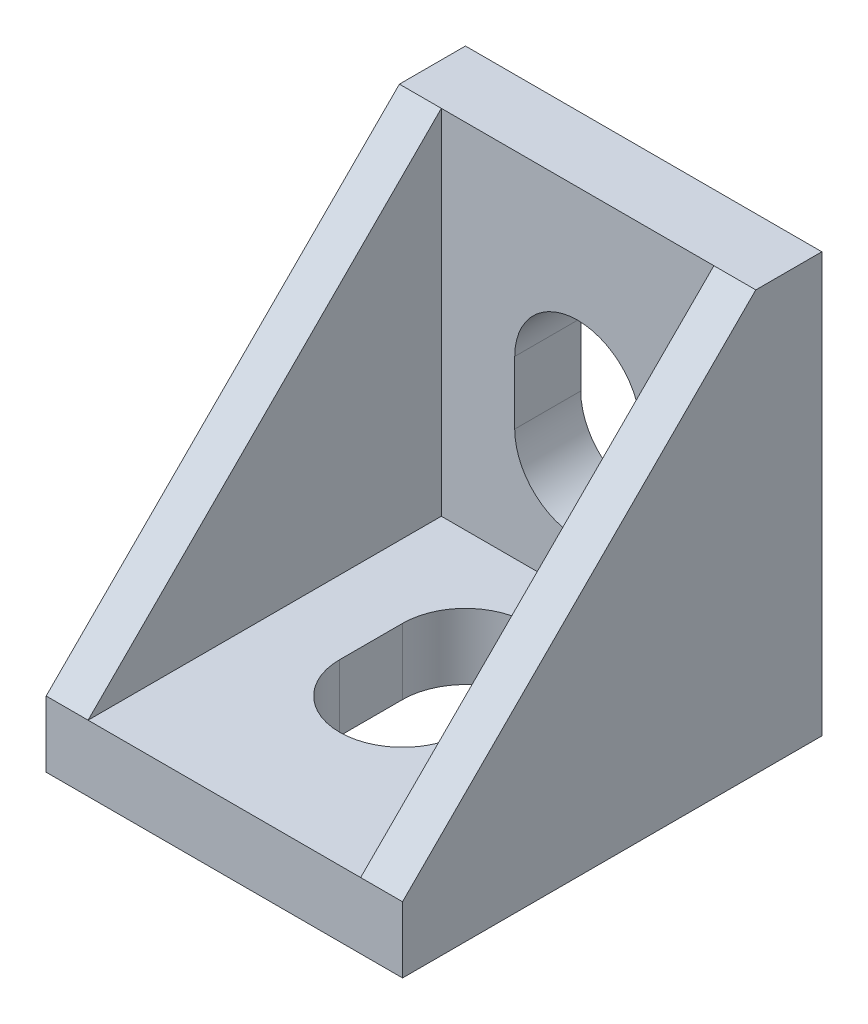
ISO-10303-21;
HEADER;
FILE_DESCRIPTION(('STEP AP214'),'2;1');
FILE_NAME('part.step','',(''),(''),'','','');
FILE_SCHEMA(('AUTOMOTIVE_DESIGN { 1 0 10303 214 1 1 1 1 }'));
ENDSEC;
DATA;
#1=APPLICATION_CONTEXT('core data for automotive mechanical design processes');
#2=APPLICATION_PROTOCOL_DEFINITION('international standard','automotive_design',2000,#1);
#3=PRODUCT_CONTEXT('',#1,'mechanical');
#4=PRODUCT('Part','Part','',(#3));
#5=PRODUCT_RELATED_PRODUCT_CATEGORY('part','',(#4));
#6=PRODUCT_DEFINITION_FORMATION('','',#4);
#7=PRODUCT_DEFINITION_CONTEXT('part definition',#1,'design');
#8=PRODUCT_DEFINITION('design','',#6,#7);
#9=PRODUCT_DEFINITION_SHAPE('','',#8);
#10=(LENGTH_UNIT() NAMED_UNIT(*) SI_UNIT(.MILLI.,.METRE.));
#11=(NAMED_UNIT(*) PLANE_ANGLE_UNIT() SI_UNIT($,.RADIAN.));
#12=(NAMED_UNIT(*) SI_UNIT($,.STERADIAN.) SOLID_ANGLE_UNIT());
#13=UNCERTAINTY_MEASURE_WITH_UNIT(LENGTH_MEASURE(1.E-05),#10,'distance_accuracy_value','');
#14=(GEOMETRIC_REPRESENTATION_CONTEXT(3) GLOBAL_UNCERTAINTY_ASSIGNED_CONTEXT((#13)) GLOBAL_UNIT_ASSIGNED_CONTEXT((#10,
#11,#12)) REPRESENTATION_CONTEXT('',''));
#15=CARTESIAN_POINT('',(0.,0.,0.));
#16=DIRECTION('',(0.,0.,1.));
#17=DIRECTION('',(1.,0.,0.));
#18=AXIS2_PLACEMENT_3D('',#15,#16,#17);
#19=CARTESIAN_POINT('',(0.,3.15,0.));
#20=DIRECTION('',(0.,-1.,0.));
#21=DIRECTION('',(0.,0.,-1.));
#22=AXIS2_PLACEMENT_3D('',#19,#20,#21);
#23=PLANE('',#22);
#24=DIRECTION('',(0.,0.,1.));
#25=VECTOR('',#24,1.);
#26=CARTESIAN_POINT('',(3.,3.15,0.));
#27=LINE('',#26,#25);
#28=CARTESIAN_POINT('',(3.,3.15,-1.5));
#29=VERTEX_POINT('',#28);
#30=CARTESIAN_POINT('',(3.,3.15,1.5));
#31=VERTEX_POINT('',#30);
#32=EDGE_CURVE('E281',#29,#31,#27,.T.);
#33=ORIENTED_EDGE('',*,*,#32,.T.);
#34=CARTESIAN_POINT('',(0.,3.15,1.5));
#35=DIRECTION('',(0.,-1.,0.));
#36=DIRECTION('',(0.,0.,-1.));
#37=AXIS2_PLACEMENT_3D('',#34,#35,#36);
#38=CIRCLE('',#37,3.);
#39=CARTESIAN_POINT('',(-3.,3.15,1.5));
#40=VERTEX_POINT('',#39);
#41=EDGE_CURVE('E284',#40,#31,#38,.F.);
#42=ORIENTED_EDGE('',*,*,#41,.F.);
#43=DIRECTION('',(0.,0.,1.));
#44=VECTOR('',#43,1.);
#45=CARTESIAN_POINT('',(-3.,3.15,0.));
#46=LINE('',#45,#44);
#47=CARTESIAN_POINT('',(-3.,3.15,-1.5));
#48=VERTEX_POINT('',#47);
#49=EDGE_CURVE('E301',#48,#40,#46,.T.);
#50=ORIENTED_EDGE('',*,*,#49,.F.);
#51=CARTESIAN_POINT('',(0.,3.15,-1.5));
#52=DIRECTION('',(0.,-1.,0.));
#53=DIRECTION('',(0.,0.,-1.));
#54=AXIS2_PLACEMENT_3D('',#51,#52,#53);
#55=CIRCLE('',#54,3.);
#56=EDGE_CURVE('E259',#29,#48,#55,.F.);
#57=ORIENTED_EDGE('',*,*,#56,.F.);
#58=EDGE_LOOP('',(#33,#42,#50,#57));
#59=FACE_BOUND('',#58,.T.);
#60=DIRECTION('',(1.,0.,0.));
#61=VECTOR('',#60,1.);
#62=CARTESIAN_POINT('',(-8.5,3.15,-6.85));
#63=LINE('',#62,#61);
#64=CARTESIAN_POINT('',(-6.5,3.15,-6.85));
#65=VERTEX_POINT('',#64);
#66=CARTESIAN_POINT('',(6.5,3.15,-6.85));
#67=VERTEX_POINT('',#66);
#68=EDGE_CURVE('E191',#65,#67,#63,.T.);
#69=ORIENTED_EDGE('',*,*,#68,.F.);
#70=DIRECTION('',(0.,0.,1.));
#71=VECTOR('',#70,1.);
#72=CARTESIAN_POINT('',(-6.5,3.15,-6.85));
#73=LINE('',#72,#71);
#74=CARTESIAN_POINT('',(-6.5,3.15,10.));
#75=VERTEX_POINT('',#74);
#76=EDGE_CURVE('E185',#65,#75,#73,.T.);
#77=ORIENTED_EDGE('',*,*,#76,.T.);
#78=DIRECTION('',(1.,0.,0.));
#79=VECTOR('',#78,1.);
#80=CARTESIAN_POINT('',(-8.5,3.15,10.));
#81=LINE('',#80,#79);
#82=CARTESIAN_POINT('',(6.5,3.15,10.));
#83=VERTEX_POINT('',#82);
#84=EDGE_CURVE('E181',#75,#83,#81,.T.);
#85=ORIENTED_EDGE('',*,*,#84,.T.);
#86=DIRECTION('',(0.,0.,-1.));
#87=VECTOR('',#86,1.);
#88=CARTESIAN_POINT('',(6.5,3.15,10.));
#89=LINE('',#88,#87);
#90=EDGE_CURVE('E244',#83,#67,#89,.T.);
#91=ORIENTED_EDGE('',*,*,#90,.T.);
#92=EDGE_LOOP('',(#69,#77,#85,#91));
#93=FACE_BOUND('',#92,.T.);
#94=ADVANCED_FACE('F57',(#59,#93),#23,.F.);
#95=CARTESIAN_POINT('',(8.5,3.15,10.));
#96=DIRECTION('',(-1.,0.,0.));
#97=DIRECTION('',(0.,0.,1.));
#98=AXIS2_PLACEMENT_3D('',#95,#96,#97);
#99=PLANE('',#98);
#100=DIRECTION('',(0.,0.,-1.));
#101=VECTOR('',#100,1.);
#102=CARTESIAN_POINT('',(8.5,0.,10.));
#103=LINE('',#102,#101);
#104=CARTESIAN_POINT('',(8.5,0.,10.));
#105=VERTEX_POINT('',#104);
#106=CARTESIAN_POINT('',(8.5,0.,-10.));
#107=VERTEX_POINT('',#106);
#108=EDGE_CURVE('E203',#105,#107,#103,.T.);
#109=ORIENTED_EDGE('',*,*,#108,.T.);
#110=DIRECTION('',(0.,-1.,0.));
#111=VECTOR('',#110,1.);
#112=CARTESIAN_POINT('',(8.5,3.15,-10.));
#113=LINE('',#112,#111);
#114=CARTESIAN_POINT('',(8.5,20.,-10.));
#115=VERTEX_POINT('',#114);
#116=EDGE_CURVE('E12',#115,#107,#113,.T.);
#117=ORIENTED_EDGE('',*,*,#116,.F.);
#118=DIRECTION('',(0.,0.,-1.));
#119=VECTOR('',#118,1.);
#120=CARTESIAN_POINT('',(8.5,20.,-10.));
#121=LINE('',#120,#119);
#122=CARTESIAN_POINT('',(8.5,20.,-6.85));
#123=VERTEX_POINT('',#122);
#124=EDGE_CURVE('E232',#123,#115,#121,.T.);
#125=ORIENTED_EDGE('',*,*,#124,.F.);
#126=DIRECTION('',(0.,-0.707106781186548,0.707106781186548));
#127=VECTOR('',#126,1.);
#128=CARTESIAN_POINT('',(8.5,20.,-6.85));
#129=LINE('',#128,#127);
#130=CARTESIAN_POINT('',(8.5,3.15,10.));
#131=VERTEX_POINT('',#130);
#132=EDGE_CURVE('E230',#123,#131,#129,.T.);
#133=ORIENTED_EDGE('',*,*,#132,.T.);
#134=DIRECTION('',(0.,-1.,0.));
#135=VECTOR('',#134,1.);
#136=CARTESIAN_POINT('',(8.5,3.15,10.));
#137=LINE('',#136,#135);
#138=EDGE_CURVE('E180',#131,#105,#137,.T.);
#139=ORIENTED_EDGE('',*,*,#138,.T.);
#140=EDGE_LOOP('',(#109,#117,#125,#133,#139));
#141=FACE_BOUND('',#140,.T.);
#142=ADVANCED_FACE('F59',(#141),#99,.F.);
#143=CARTESIAN_POINT('',(-8.5,3.15,-10.));
#144=DIRECTION('',(0.,0.,1.));
#145=DIRECTION('',(1.,0.,0.));
#146=AXIS2_PLACEMENT_3D('',#143,#144,#145);
#147=PLANE('',#146);
#148=CARTESIAN_POINT('',(0.,8.5,-10.));
#149=DIRECTION('',(0.,0.,-1.));
#150=DIRECTION('',(-1.,0.,0.));
#151=AXIS2_PLACEMENT_3D('',#148,#149,#150);
#152=CIRCLE('',#151,3.);
#153=CARTESIAN_POINT('',(3.,8.5,-10.));
#154=VERTEX_POINT('',#153);
#155=CARTESIAN_POINT('',(-3.,8.5,-10.));
#156=VERTEX_POINT('',#155);
#157=EDGE_CURVE('E80',#154,#156,#152,.T.);
#158=ORIENTED_EDGE('',*,*,#157,.F.);
#159=DIRECTION('',(0.,-1.,0.));
#160=VECTOR('',#159,1.);
#161=CARTESIAN_POINT('',(3.,11.5,-10.));
#162=LINE('',#161,#160);
#163=CARTESIAN_POINT('',(3.,11.5,-10.));
#164=VERTEX_POINT('',#163);
#165=EDGE_CURVE('E264',#164,#154,#162,.T.);
#166=ORIENTED_EDGE('',*,*,#165,.F.);
#167=CARTESIAN_POINT('',(0.,11.5,-10.));
#168=DIRECTION('',(0.,0.,-1.));
#169=DIRECTION('',(-1.,0.,0.));
#170=AXIS2_PLACEMENT_3D('',#167,#168,#169);
#171=CIRCLE('',#170,3.);
#172=CARTESIAN_POINT('',(-3.,11.5,-10.));
#173=VERTEX_POINT('',#172);
#174=EDGE_CURVE('E260',#173,#164,#171,.T.);
#175=ORIENTED_EDGE('',*,*,#174,.F.);
#176=DIRECTION('',(0.,-1.,0.));
#177=VECTOR('',#176,1.);
#178=CARTESIAN_POINT('',(-3.,11.5,-10.));
#179=LINE('',#178,#177);
#180=EDGE_CURVE('E274',#173,#156,#179,.T.);
#181=ORIENTED_EDGE('',*,*,#180,.T.);
#182=EDGE_LOOP('',(#158,#166,#175,#181));
#183=FACE_BOUND('',#182,.T.);
#184=DIRECTION('',(-1.,0.,0.));
#185=VECTOR('',#184,1.);
#186=CARTESIAN_POINT('',(-8.5,0.,-10.));
#187=LINE('',#186,#185);
#188=CARTESIAN_POINT('',(-8.5,0.,-10.));
#189=VERTEX_POINT('',#188);
#190=EDGE_CURVE('E206',#107,#189,#187,.T.);
#191=ORIENTED_EDGE('',*,*,#190,.T.);
#192=DIRECTION('',(0.,-1.,0.));
#193=VECTOR('',#192,1.);
#194=CARTESIAN_POINT('',(-8.5,3.15,-10.));
#195=LINE('',#194,#193);
#196=CARTESIAN_POINT('',(-8.5,20.,-10.));
#197=VERTEX_POINT('',#196);
#198=EDGE_CURVE('E65',#197,#189,#195,.T.);
#199=ORIENTED_EDGE('',*,*,#198,.F.);
#200=DIRECTION('',(-1.,0.,0.));
#201=VECTOR('',#200,1.);
#202=CARTESIAN_POINT('',(-8.5,20.,-10.));
#203=LINE('',#202,#201);
#204=EDGE_CURVE('E207',#115,#197,#203,.T.);
#205=ORIENTED_EDGE('',*,*,#204,.F.);
#206=ORIENTED_EDGE('',*,*,#116,.T.);
#207=EDGE_LOOP('',(#191,#199,#205,#206));
#208=FACE_BOUND('',#207,.T.);
#209=ADVANCED_FACE('F317',(#183,#208),#147,.F.);
#210=CARTESIAN_POINT('',(-8.5,3.15,10.));
#211=DIRECTION('',(1.,0.,0.));
#212=DIRECTION('',(0.,0.,-1.));
#213=AXIS2_PLACEMENT_3D('',#210,#211,#212);
#214=PLANE('',#213);
#215=DIRECTION('',(0.,-1.,0.));
#216=VECTOR('',#215,1.);
#217=CARTESIAN_POINT('',(-8.5,3.15,10.));
#218=LINE('',#217,#216);
#219=CARTESIAN_POINT('',(-8.5,3.15,10.));
#220=VERTEX_POINT('',#219);
#221=CARTESIAN_POINT('',(-8.5,0.,10.));
#222=VERTEX_POINT('',#221);
#223=EDGE_CURVE('E212',#220,#222,#218,.T.);
#224=ORIENTED_EDGE('',*,*,#223,.F.);
#225=DIRECTION('',(0.,0.707106781186548,-0.707106781186548));
#226=VECTOR('',#225,1.);
#227=CARTESIAN_POINT('',(-8.5,3.15,10.));
#228=LINE('',#227,#226);
#229=CARTESIAN_POINT('',(-8.5,20.,-6.85));
#230=VERTEX_POINT('',#229);
#231=EDGE_CURVE('E175',#220,#230,#228,.T.);
#232=ORIENTED_EDGE('',*,*,#231,.T.);
#233=DIRECTION('',(0.,0.,1.));
#234=VECTOR('',#233,1.);
#235=CARTESIAN_POINT('',(-8.5,20.,-10.));
#236=LINE('',#235,#234);
#237=EDGE_CURVE('E219',#197,#230,#236,.T.);
#238=ORIENTED_EDGE('',*,*,#237,.F.);
#239=ORIENTED_EDGE('',*,*,#198,.T.);
#240=DIRECTION('',(0.,0.,1.));
#241=VECTOR('',#240,1.);
#242=CARTESIAN_POINT('',(-8.5,0.,10.));
#243=LINE('',#242,#241);
#244=EDGE_CURVE('E198',#189,#222,#243,.T.);
#245=ORIENTED_EDGE('',*,*,#244,.T.);
#246=EDGE_LOOP('',(#224,#232,#238,#239,#245));
#247=FACE_BOUND('',#246,.T.);
#248=ADVANCED_FACE('F217',(#247),#214,.F.);
#249=CARTESIAN_POINT('',(-8.5,3.15,10.));
#250=DIRECTION('',(0.,0.,-1.));
#251=DIRECTION('',(-1.,0.,0.));
#252=AXIS2_PLACEMENT_3D('',#249,#250,#251);
#253=PLANE('',#252);
#254=DIRECTION('',(1.,0.,0.));
#255=VECTOR('',#254,1.);
#256=CARTESIAN_POINT('',(-8.5,0.,10.));
#257=LINE('',#256,#255);
#258=EDGE_CURVE('E197',#222,#105,#257,.T.);
#259=ORIENTED_EDGE('',*,*,#258,.T.);
#260=ORIENTED_EDGE('',*,*,#138,.F.);
#261=DIRECTION('',(1.,0.,0.));
#262=VECTOR('',#261,1.);
#263=CARTESIAN_POINT('',(6.5,3.15,10.));
#264=LINE('',#263,#262);
#265=EDGE_CURVE('E196',#83,#131,#264,.T.);
#266=ORIENTED_EDGE('',*,*,#265,.F.);
#267=ORIENTED_EDGE('',*,*,#84,.F.);
#268=EDGE_CURVE('E170',#220,#75,#81,.T.);
#269=ORIENTED_EDGE('',*,*,#268,.F.);
#270=ORIENTED_EDGE('',*,*,#223,.T.);
#271=EDGE_LOOP('',(#259,#260,#266,#267,#269,#270));
#272=FACE_BOUND('',#271,.T.);
#273=ADVANCED_FACE('F194',(#272),#253,.F.);
#274=CARTESIAN_POINT('',(0.,0.,0.));
#275=DIRECTION('',(0.,-1.,0.));
#276=DIRECTION('',(0.,0.,-1.));
#277=AXIS2_PLACEMENT_3D('',#274,#275,#276);
#278=PLANE('',#277);
#279=CARTESIAN_POINT('',(0.,0.,1.5));
#280=DIRECTION('',(0.,-1.,0.));
#281=DIRECTION('',(0.,0.,-1.));
#282=AXIS2_PLACEMENT_3D('',#279,#280,#281);
#283=CIRCLE('',#282,3.);
#284=CARTESIAN_POINT('',(3.,0.,1.5));
#285=VERTEX_POINT('',#284);
#286=CARTESIAN_POINT('',(-3.,0.,1.5));
#287=VERTEX_POINT('',#286);
#288=EDGE_CURVE('E287',#285,#287,#283,.T.);
#289=ORIENTED_EDGE('',*,*,#288,.F.);
#290=DIRECTION('',(0.,0.,-1.));
#291=VECTOR('',#290,1.);
#292=CARTESIAN_POINT('',(3.,0.,0.));
#293=LINE('',#292,#291);
#294=CARTESIAN_POINT('',(3.,0.,-1.5));
#295=VERTEX_POINT('',#294);
#296=EDGE_CURVE('E295',#285,#295,#293,.T.);
#297=ORIENTED_EDGE('',*,*,#296,.T.);
#298=CARTESIAN_POINT('',(0.,0.,-1.5));
#299=DIRECTION('',(0.,-1.,0.));
#300=DIRECTION('',(0.,0.,-1.));
#301=AXIS2_PLACEMENT_3D('',#298,#299,#300);
#302=CIRCLE('',#301,3.);
#303=CARTESIAN_POINT('',(-3.,0.,-1.5));
#304=VERTEX_POINT('',#303);
#305=EDGE_CURVE('E292',#304,#295,#302,.T.);
#306=ORIENTED_EDGE('',*,*,#305,.F.);
#307=DIRECTION('',(0.,0.,-1.));
#308=VECTOR('',#307,1.);
#309=CARTESIAN_POINT('',(-3.,0.,0.));
#310=LINE('',#309,#308);
#311=EDGE_CURVE('E290',#287,#304,#310,.T.);
#312=ORIENTED_EDGE('',*,*,#311,.F.);
#313=EDGE_LOOP('',(#289,#297,#306,#312));
#314=FACE_BOUND('',#313,.T.);
#315=ORIENTED_EDGE('',*,*,#108,.F.);
#316=ORIENTED_EDGE('',*,*,#258,.F.);
#317=ORIENTED_EDGE('',*,*,#244,.F.);
#318=ORIENTED_EDGE('',*,*,#190,.F.);
#319=EDGE_LOOP('',(#315,#316,#317,#318));
#320=FACE_BOUND('',#319,.T.);
#321=ADVANCED_FACE('F226',(#314,#320),#278,.T.);
#322=CARTESIAN_POINT('',(-8.5,20.,-6.85));
#323=DIRECTION('',(0.,0.,-1.));
#324=DIRECTION('',(-1.,0.,0.));
#325=AXIS2_PLACEMENT_3D('',#322,#323,#324);
#326=PLANE('',#325);
#327=CARTESIAN_POINT('',(0.,11.5,-6.85));
#328=DIRECTION('',(0.,0.,-1.));
#329=DIRECTION('',(-1.,0.,0.));
#330=AXIS2_PLACEMENT_3D('',#327,#328,#329);
#331=CIRCLE('',#330,3.);
#332=CARTESIAN_POINT('',(3.,11.5,-6.85));
#333=VERTEX_POINT('',#332);
#334=CARTESIAN_POINT('',(-3.,11.5,-6.85));
#335=VERTEX_POINT('',#334);
#336=EDGE_CURVE('E252',#333,#335,#331,.F.);
#337=ORIENTED_EDGE('',*,*,#336,.F.);
#338=DIRECTION('',(0.,1.,0.));
#339=VECTOR('',#338,1.);
#340=CARTESIAN_POINT('',(3.,11.5,-6.85));
#341=LINE('',#340,#339);
#342=CARTESIAN_POINT('',(3.,8.5,-6.85));
#343=VERTEX_POINT('',#342);
#344=EDGE_CURVE('E247',#343,#333,#341,.T.);
#345=ORIENTED_EDGE('',*,*,#344,.F.);
#346=CARTESIAN_POINT('',(0.,8.5,-6.85));
#347=DIRECTION('',(0.,0.,-1.));
#348=DIRECTION('',(-1.,0.,0.));
#349=AXIS2_PLACEMENT_3D('',#346,#347,#348);
#350=CIRCLE('',#349,3.);
#351=CARTESIAN_POINT('',(-3.,8.5,-6.85));
#352=VERTEX_POINT('',#351);
#353=EDGE_CURVE('E255',#352,#343,#350,.F.);
#354=ORIENTED_EDGE('',*,*,#353,.F.);
#355=DIRECTION('',(0.,1.,0.));
#356=VECTOR('',#355,1.);
#357=CARTESIAN_POINT('',(-3.,11.5,-6.85));
#358=LINE('',#357,#356);
#359=EDGE_CURVE('E271',#352,#335,#358,.T.);
#360=ORIENTED_EDGE('',*,*,#359,.T.);
#361=EDGE_LOOP('',(#337,#345,#354,#360));
#362=FACE_BOUND('',#361,.T.);
#363=DIRECTION('',(1.,0.,0.));
#364=VECTOR('',#363,1.);
#365=CARTESIAN_POINT('',(-8.5,20.,-6.85));
#366=LINE('',#365,#364);
#367=CARTESIAN_POINT('',(-6.5,20.,-6.85));
#368=VERTEX_POINT('',#367);
#369=CARTESIAN_POINT('',(6.5,20.,-6.85));
#370=VERTEX_POINT('',#369);
#371=EDGE_CURVE('E311',#368,#370,#366,.T.);
#372=ORIENTED_EDGE('',*,*,#371,.F.);
#373=DIRECTION('',(0.,-1.,0.));
#374=VECTOR('',#373,1.);
#375=CARTESIAN_POINT('',(-6.5,20.,-6.85));
#376=LINE('',#375,#374);
#377=EDGE_CURVE('E72',#368,#65,#376,.T.);
#378=ORIENTED_EDGE('',*,*,#377,.T.);
#379=ORIENTED_EDGE('',*,*,#68,.T.);
#380=DIRECTION('',(0.,1.,0.));
#381=VECTOR('',#380,1.);
#382=CARTESIAN_POINT('',(6.5,3.15,-6.85));
#383=LINE('',#382,#381);
#384=EDGE_CURVE('E236',#67,#370,#383,.T.);
#385=ORIENTED_EDGE('',*,*,#384,.T.);
#386=EDGE_LOOP('',(#372,#378,#379,#385));
#387=FACE_BOUND('',#386,.T.);
#388=ADVANCED_FACE('F332',(#362,#387),#326,.F.);
#389=CARTESIAN_POINT('',(0.,20.,0.));
#390=DIRECTION('',(0.,1.,0.));
#391=DIRECTION('',(0.,0.,1.));
#392=AXIS2_PLACEMENT_3D('',#389,#390,#391);
#393=PLANE('',#392);
#394=ORIENTED_EDGE('',*,*,#237,.T.);
#395=EDGE_CURVE('E312',#230,#368,#366,.T.);
#396=ORIENTED_EDGE('',*,*,#395,.T.);
#397=ORIENTED_EDGE('',*,*,#371,.T.);
#398=DIRECTION('',(1.,0.,0.));
#399=VECTOR('',#398,1.);
#400=CARTESIAN_POINT('',(6.5,20.,-6.85));
#401=LINE('',#400,#399);
#402=EDGE_CURVE('E248',#370,#123,#401,.T.);
#403=ORIENTED_EDGE('',*,*,#402,.T.);
#404=ORIENTED_EDGE('',*,*,#124,.T.);
#405=ORIENTED_EDGE('',*,*,#204,.T.);
#406=EDGE_LOOP('',(#394,#396,#397,#403,#404,#405));
#407=FACE_BOUND('',#406,.T.);
#408=ADVANCED_FACE('F316',(#407),#393,.T.);
#409=CARTESIAN_POINT('',(-3.,20.001,0.));
#410=DIRECTION('',(-1.,0.,0.));
#411=DIRECTION('',(0.,0.,1.));
#412=AXIS2_PLACEMENT_3D('',#409,#410,#411);
#413=PLANE('',#412);
#414=ORIENTED_EDGE('',*,*,#49,.T.);
#415=DIRECTION('',(0.,-1.,0.));
#416=VECTOR('',#415,1.);
#417=CARTESIAN_POINT('',(-3.,20.001,1.5));
#418=LINE('',#417,#416);
#419=EDGE_CURVE('E298',#40,#287,#418,.T.);
#420=ORIENTED_EDGE('',*,*,#419,.T.);
#421=ORIENTED_EDGE('',*,*,#311,.T.);
#422=DIRECTION('',(0.,-1.,0.));
#423=VECTOR('',#422,1.);
#424=CARTESIAN_POINT('',(-3.,20.001,-1.5));
#425=LINE('',#424,#423);
#426=EDGE_CURVE('E304',#48,#304,#425,.T.);
#427=ORIENTED_EDGE('',*,*,#426,.F.);
#428=EDGE_LOOP('',(#414,#420,#421,#427));
#429=FACE_BOUND('',#428,.T.);
#430=ADVANCED_FACE('F359',(#429),#413,.F.);
#431=CARTESIAN_POINT('',(3.,20.001,0.));
#432=DIRECTION('',(-1.,0.,0.));
#433=DIRECTION('',(0.,0.,1.));
#434=AXIS2_PLACEMENT_3D('',#431,#432,#433);
#435=PLANE('',#434);
#436=DIRECTION('',(0.,-1.,0.));
#437=VECTOR('',#436,1.);
#438=CARTESIAN_POINT('',(3.,20.001,-1.5));
#439=LINE('',#438,#437);
#440=EDGE_CURVE('E302',#29,#295,#439,.T.);
#441=ORIENTED_EDGE('',*,*,#440,.T.);
#442=ORIENTED_EDGE('',*,*,#296,.F.);
#443=DIRECTION('',(0.,-1.,0.));
#444=VECTOR('',#443,1.);
#445=CARTESIAN_POINT('',(3.,20.001,1.5));
#446=LINE('',#445,#444);
#447=EDGE_CURVE('E299',#31,#285,#446,.T.);
#448=ORIENTED_EDGE('',*,*,#447,.F.);
#449=ORIENTED_EDGE('',*,*,#32,.F.);
#450=EDGE_LOOP('',(#441,#442,#448,#449));
#451=FACE_BOUND('',#450,.T.);
#452=ADVANCED_FACE('F366',(#451),#435,.T.);
#453=CARTESIAN_POINT('',(0.,20.001,1.5));
#454=DIRECTION('',(0.,-1.,0.));
#455=DIRECTION('',(0.,0.,-1.));
#456=AXIS2_PLACEMENT_3D('',#453,#454,#455);
#457=CYLINDRICAL_SURFACE('',#456,3.);
#458=ORIENTED_EDGE('',*,*,#41,.T.);
#459=ORIENTED_EDGE('',*,*,#447,.T.);
#460=ORIENTED_EDGE('',*,*,#288,.T.);
#461=ORIENTED_EDGE('',*,*,#419,.F.);
#462=EDGE_LOOP('',(#458,#459,#460,#461));
#463=FACE_BOUND('',#462,.T.);
#464=ADVANCED_FACE('F360',(#463),#457,.F.);
#465=CARTESIAN_POINT('',(0.,20.001,-1.5));
#466=DIRECTION('',(0.,-1.,0.));
#467=DIRECTION('',(0.,0.,-1.));
#468=AXIS2_PLACEMENT_3D('',#465,#466,#467);
#469=CYLINDRICAL_SURFACE('',#468,3.);
#470=ORIENTED_EDGE('',*,*,#56,.T.);
#471=ORIENTED_EDGE('',*,*,#426,.T.);
#472=ORIENTED_EDGE('',*,*,#305,.T.);
#473=ORIENTED_EDGE('',*,*,#440,.F.);
#474=EDGE_LOOP('',(#470,#471,#472,#473));
#475=FACE_BOUND('',#474,.T.);
#476=ADVANCED_FACE('F369',(#475),#469,.F.);
#477=CARTESIAN_POINT('',(0.,8.5,10.001));
#478=DIRECTION('',(0.,0.,-1.));
#479=DIRECTION('',(-1.,0.,0.));
#480=AXIS2_PLACEMENT_3D('',#477,#478,#479);
#481=CYLINDRICAL_SURFACE('',#480,3.);
#482=ORIENTED_EDGE('',*,*,#353,.T.);
#483=DIRECTION('',(0.,0.,-1.));
#484=VECTOR('',#483,1.);
#485=CARTESIAN_POINT('',(3.,8.5,10.001));
#486=LINE('',#485,#484);
#487=EDGE_CURVE('E251',#343,#154,#486,.T.);
#488=ORIENTED_EDGE('',*,*,#487,.T.);
#489=ORIENTED_EDGE('',*,*,#157,.T.);
#490=DIRECTION('',(0.,0.,-1.));
#491=VECTOR('',#490,1.);
#492=CARTESIAN_POINT('',(-3.,8.5,10.001));
#493=LINE('',#492,#491);
#494=EDGE_CURVE('E253',#352,#156,#493,.T.);
#495=ORIENTED_EDGE('',*,*,#494,.F.);
#496=EDGE_LOOP('',(#482,#488,#489,#495));
#497=FACE_BOUND('',#496,.T.);
#498=ADVANCED_FACE('F377',(#497),#481,.F.);
#499=CARTESIAN_POINT('',(0.,11.5,10.001));
#500=DIRECTION('',(0.,0.,-1.));
#501=DIRECTION('',(-1.,0.,0.));
#502=AXIS2_PLACEMENT_3D('',#499,#500,#501);
#503=CYLINDRICAL_SURFACE('',#502,3.);
#504=ORIENTED_EDGE('',*,*,#336,.T.);
#505=DIRECTION('',(0.,0.,-1.));
#506=VECTOR('',#505,1.);
#507=CARTESIAN_POINT('',(-3.,11.5,10.001));
#508=LINE('',#507,#506);
#509=EDGE_CURVE('E263',#335,#173,#508,.T.);
#510=ORIENTED_EDGE('',*,*,#509,.T.);
#511=ORIENTED_EDGE('',*,*,#174,.T.);
#512=DIRECTION('',(0.,0.,-1.));
#513=VECTOR('',#512,1.);
#514=CARTESIAN_POINT('',(3.,11.5,10.001));
#515=LINE('',#514,#513);
#516=EDGE_CURVE('E265',#333,#164,#515,.T.);
#517=ORIENTED_EDGE('',*,*,#516,.F.);
#518=EDGE_LOOP('',(#504,#510,#511,#517));
#519=FACE_BOUND('',#518,.T.);
#520=ADVANCED_FACE('F397',(#519),#503,.F.);
#521=CARTESIAN_POINT('',(3.,11.5,10.001));
#522=DIRECTION('',(1.,0.,0.));
#523=DIRECTION('',(0.,0.,-1.));
#524=AXIS2_PLACEMENT_3D('',#521,#522,#523);
#525=PLANE('',#524);
#526=ORIENTED_EDGE('',*,*,#344,.T.);
#527=ORIENTED_EDGE('',*,*,#516,.T.);
#528=ORIENTED_EDGE('',*,*,#165,.T.);
#529=ORIENTED_EDGE('',*,*,#487,.F.);
#530=EDGE_LOOP('',(#526,#527,#528,#529));
#531=FACE_BOUND('',#530,.T.);
#532=ADVANCED_FACE('F405',(#531),#525,.F.);
#533=CARTESIAN_POINT('',(-3.,11.5,10.001));
#534=DIRECTION('',(1.,0.,0.));
#535=DIRECTION('',(0.,0.,-1.));
#536=AXIS2_PLACEMENT_3D('',#533,#534,#535);
#537=PLANE('',#536);
#538=ORIENTED_EDGE('',*,*,#494,.T.);
#539=ORIENTED_EDGE('',*,*,#180,.F.);
#540=ORIENTED_EDGE('',*,*,#509,.F.);
#541=ORIENTED_EDGE('',*,*,#359,.F.);
#542=EDGE_LOOP('',(#538,#539,#540,#541));
#543=FACE_BOUND('',#542,.T.);
#544=ADVANCED_FACE('F399',(#543),#537,.T.);
#545=CARTESIAN_POINT('',(6.5,20.,-6.85));
#546=DIRECTION('',(0.,0.707106781186547,0.707106781186547));
#547=DIRECTION('',(0.,-0.707106781186548,0.707106781186548));
#548=AXIS2_PLACEMENT_3D('',#545,#546,#547);
#549=PLANE('',#548);
#550=ORIENTED_EDGE('',*,*,#132,.F.);
#551=ORIENTED_EDGE('',*,*,#402,.F.);
#552=DIRECTION('',(0.,-0.707106781186548,0.707106781186548));
#553=VECTOR('',#552,1.);
#554=CARTESIAN_POINT('',(6.5,20.,-6.85));
#555=LINE('',#554,#553);
#556=EDGE_CURVE('E239',#370,#83,#555,.T.);
#557=ORIENTED_EDGE('',*,*,#556,.T.);
#558=ORIENTED_EDGE('',*,*,#265,.T.);
#559=EDGE_LOOP('',(#550,#551,#557,#558));
#560=FACE_BOUND('',#559,.T.);
#561=ADVANCED_FACE('F408',(#560),#549,.T.);
#562=CARTESIAN_POINT('',(6.5,0.,0.));
#563=DIRECTION('',(-1.,0.,0.));
#564=DIRECTION('',(0.,0.,1.));
#565=AXIS2_PLACEMENT_3D('',#562,#563,#564);
#566=PLANE('',#565);
#567=ORIENTED_EDGE('',*,*,#384,.F.);
#568=ORIENTED_EDGE('',*,*,#90,.F.);
#569=ORIENTED_EDGE('',*,*,#556,.F.);
#570=EDGE_LOOP('',(#567,#568,#569));
#571=FACE_BOUND('',#570,.T.);
#572=ADVANCED_FACE('F429',(#571),#566,.T.);
#573=CARTESIAN_POINT('',(-6.5,3.15,10.));
#574=DIRECTION('',(0.,0.707106781186547,0.707106781186547));
#575=DIRECTION('',(0.,-0.707106781186548,0.707106781186548));
#576=AXIS2_PLACEMENT_3D('',#573,#574,#575);
#577=PLANE('',#576);
#578=ORIENTED_EDGE('',*,*,#231,.F.);
#579=ORIENTED_EDGE('',*,*,#268,.T.);
#580=DIRECTION('',(0.,0.707106781186548,-0.707106781186548));
#581=VECTOR('',#580,1.);
#582=CARTESIAN_POINT('',(-6.5,3.15,10.));
#583=LINE('',#582,#581);
#584=EDGE_CURVE('E172',#75,#368,#583,.T.);
#585=ORIENTED_EDGE('',*,*,#584,.T.);
#586=ORIENTED_EDGE('',*,*,#395,.F.);
#587=EDGE_LOOP('',(#578,#579,#585,#586));
#588=FACE_BOUND('',#587,.T.);
#589=ADVANCED_FACE('F171',(#588),#577,.T.);
#590=CARTESIAN_POINT('',(-6.5,0.,0.));
#591=DIRECTION('',(1.,0.,0.));
#592=DIRECTION('',(0.,0.,-1.));
#593=AXIS2_PLACEMENT_3D('',#590,#591,#592);
#594=PLANE('',#593);
#595=ORIENTED_EDGE('',*,*,#76,.F.);
#596=ORIENTED_EDGE('',*,*,#377,.F.);
#597=ORIENTED_EDGE('',*,*,#584,.F.);
#598=EDGE_LOOP('',(#595,#596,#597));
#599=FACE_BOUND('',#598,.T.);
#600=ADVANCED_FACE('F184',(#599),#594,.T.);
#601=CLOSED_SHELL('',(#94,#142,#209,#248,#273,#321,#388,#408,#430,#452,#464,#476,#498,#520,#532,
#544,#561,#572,#589,#600));
#602=MANIFOLD_SOLID_BREP('B2',#601);
#603=ADVANCED_BREP_SHAPE_REPRESENTATION('',(#18,#602),#14);
#604=SHAPE_DEFINITION_REPRESENTATION(#9,#603);
ENDSEC;
END-ISO-10303-21;
